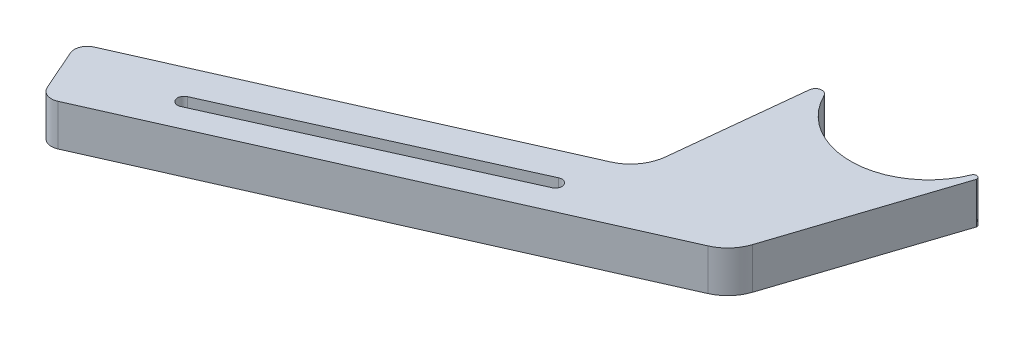
ISO-10303-21;
HEADER;
FILE_DESCRIPTION(('STEP AP214'),'2;1');
FILE_NAME('part.step','',(''),(''),'','','');
FILE_SCHEMA(('AUTOMOTIVE_DESIGN { 1 0 10303 214 1 1 1 1 }'));
ENDSEC;
DATA;
#1=APPLICATION_CONTEXT('core data for automotive mechanical design processes');
#2=APPLICATION_PROTOCOL_DEFINITION('international standard','automotive_design',2000,#1);
#3=PRODUCT_CONTEXT('',#1,'mechanical');
#4=PRODUCT('Part','Part','',(#3));
#5=PRODUCT_RELATED_PRODUCT_CATEGORY('part','',(#4));
#6=PRODUCT_DEFINITION_FORMATION('','',#4);
#7=PRODUCT_DEFINITION_CONTEXT('part definition',#1,'design');
#8=PRODUCT_DEFINITION('design','',#6,#7);
#9=PRODUCT_DEFINITION_SHAPE('','',#8);
#10=(LENGTH_UNIT() NAMED_UNIT(*) SI_UNIT(.MILLI.,.METRE.));
#11=(NAMED_UNIT(*) PLANE_ANGLE_UNIT() SI_UNIT($,.RADIAN.));
#12=(NAMED_UNIT(*) SI_UNIT($,.STERADIAN.) SOLID_ANGLE_UNIT());
#13=UNCERTAINTY_MEASURE_WITH_UNIT(LENGTH_MEASURE(1.E-05),#10,'distance_accuracy_value','');
#14=(GEOMETRIC_REPRESENTATION_CONTEXT(3) GLOBAL_UNCERTAINTY_ASSIGNED_CONTEXT((#13)) GLOBAL_UNIT_ASSIGNED_CONTEXT((#10,
#11,#12)) REPRESENTATION_CONTEXT('',''));
#15=CARTESIAN_POINT('',(0.,0.,0.));
#16=DIRECTION('',(0.,0.,1.));
#17=DIRECTION('',(1.,0.,0.));
#18=AXIS2_PLACEMENT_3D('',#15,#16,#17);
#19=CARTESIAN_POINT('',(-11.6659301366889,6.35,13.7782963331069));
#20=DIRECTION('',(0.,1.,0.));
#21=DIRECTION('',(0.,0.,1.));
#22=AXIS2_PLACEMENT_3D('',#19,#20,#21);
#23=PLANE('',#22);
#24=CARTESIAN_POINT('',(-11.6659301366889,6.35,13.7782963331069));
#25=DIRECTION('',(0.,1.,0.));
#26=DIRECTION('',(0.,0.,1.));
#27=AXIS2_PLACEMENT_3D('',#24,#25,#26);
#28=CIRCLE('',#27,1.);
#29=CARTESIAN_POINT('',(-10.7685508954051,6.35,13.3370362087891));
#30=VERTEX_POINT('',#29);
#31=CARTESIAN_POINT('',(-12.6603165664999,6.35,13.6724869374577));
#32=VERTEX_POINT('',#31);
#33=EDGE_CURVE('E182',#30,#32,#28,.T.);
#34=ORIENTED_EDGE('',*,*,#33,.T.);
#35=DIRECTION('',(-0.105809395649239,0.,0.994386429811038));
#36=VECTOR('',#35,1.);
#37=CARTESIAN_POINT('',(-12.6603165664999,6.35,13.6724869374577));
#38=LINE('',#37,#36);
#39=CARTESIAN_POINT('',(-14.7936717014823,6.35,33.7215514196568));
#40=VERTEX_POINT('',#39);
#41=EDGE_CURVE('E185',#32,#40,#38,.T.);
#42=ORIENTED_EDGE('',*,*,#41,.T.);
#43=CARTESIAN_POINT('',(-20.7599902803485,6.35,33.0866950457614));
#44=DIRECTION('',(0.,-1.,0.));
#45=DIRECTION('',(0.,0.,-1.));
#46=AXIS2_PLACEMENT_3D('',#43,#44,#45);
#47=CIRCLE('',#46,6.);
#48=CARTESIAN_POINT('',(-18.3266327384633,6.35,38.5711066890783));
#49=VERTEX_POINT('',#48);
#50=EDGE_CURVE('E188',#40,#49,#47,.T.);
#51=ORIENTED_EDGE('',*,*,#50,.T.);
#52=DIRECTION('',(-0.914068607219491,0.,0.405559590314197));
#53=VECTOR('',#52,1.);
#54=CARTESIAN_POINT('',(-18.3266327384633,6.35,38.5711066890783));
#55=LINE('',#54,#53);
#56=CARTESIAN_POINT('',(-73.3320689854085,6.35,62.9762574766363));
#57=VERTEX_POINT('',#56);
#58=EDGE_CURVE('E190',#49,#57,#55,.T.);
#59=ORIENTED_EDGE('',*,*,#58,.T.);
#60=CARTESIAN_POINT('',(-72.5209498047802,6.35,64.8043946910753));
#61=DIRECTION('',(0.,1.,0.));
#62=DIRECTION('',(0.,0.,-1.));
#63=AXIS2_PLACEMENT_3D('',#60,#61,#62);
#64=CIRCLE('',#63,2.);
#65=CARTESIAN_POINT('',(-74.3490870192191,6.35,65.6155138717037));
#66=VERTEX_POINT('',#65);
#67=EDGE_CURVE('E192',#57,#66,#64,.T.);
#68=ORIENTED_EDGE('',*,*,#67,.T.);
#69=DIRECTION('',(0.4055595903142,0.,0.91406860721949));
#70=VECTOR('',#69,1.);
#71=CARTESIAN_POINT('',(-74.3490870192191,6.35,65.6155138717037));
#72=LINE('',#71,#70);
#73=CARTESIAN_POINT('',(-71.5344637804712,6.35,71.9592394428257));
#74=VERTEX_POINT('',#73);
#75=EDGE_CURVE('E194',#66,#74,#72,.T.);
#76=ORIENTED_EDGE('',*,*,#75,.T.);
#77=CARTESIAN_POINT('',(-69.7063265660322,6.35,71.1481202621973));
#78=DIRECTION('',(0.,1.,0.));
#79=DIRECTION('',(0.,0.,-1.));
#80=AXIS2_PLACEMENT_3D('',#77,#78,#79);
#81=CIRCLE('',#80,2.);
#82=CARTESIAN_POINT('',(-68.8952073854038,6.35,72.9762574766363));
#83=VERTEX_POINT('',#82);
#84=EDGE_CURVE('E196',#74,#83,#81,.T.);
#85=ORIENTED_EDGE('',*,*,#84,.T.);
#86=DIRECTION('',(0.914068607219488,0.,-0.405559590314204));
#87=VECTOR('',#86,1.);
#88=CARTESIAN_POINT('',(-68.8952073854038,6.35,72.9762574766363));
#89=LINE('',#88,#87);
#90=CARTESIAN_POINT('',(0.303992163412194,6.35,42.2735303537151));
#91=VERTEX_POINT('',#90);
#92=EDGE_CURVE('E198',#83,#91,#89,.T.);
#93=ORIENTED_EDGE('',*,*,#92,.T.);
#94=CARTESIAN_POINT('',(-2.129365378473,6.35,36.7891187103981));
#95=DIRECTION('',(0.,1.,0.));
#96=DIRECTION('',(0.,0.,-1.));
#97=AXIS2_PLACEMENT_3D('',#94,#95,#96);
#98=CIRCLE('',#97,6.);
#99=CARTESIAN_POINT('',(3.57063844024517,6.35,38.6626064916762));
#100=VERTEX_POINT('',#99);
#101=EDGE_CURVE('E200',#91,#100,#98,.T.);
#102=ORIENTED_EDGE('',*,*,#101,.T.);
#103=DIRECTION('',(0.312247963546347,0.,-0.950000636453028));
#104=VECTOR('',#103,1.);
#105=CARTESIAN_POINT('',(12.0827919355146,6.35,12.7647554816999));
#106=LINE('',#105,#104);
#107=CARTESIAN_POINT('',(12.0827919355146,6.35,12.7647554816999));
#108=VERTEX_POINT('',#107);
#109=EDGE_CURVE('E202',#100,#108,#106,.T.);
#110=ORIENTED_EDGE('',*,*,#109,.T.);
#111=CARTESIAN_POINT('',(11.5833889225984,6.35,12.740329456845));
#112=DIRECTION('',(0.,1.,0.));
#113=DIRECTION('',(0.,0.,1.));
#114=AXIS2_PLACEMENT_3D('',#111,#112,#113);
#115=CIRCLE('',#114,0.499999999999999);
#116=CARTESIAN_POINT('',(11.1200533656944,6.35,12.5523928672502));
#117=VERTEX_POINT('',#116);
#118=EDGE_CURVE('E204',#108,#117,#115,.T.);
#119=ORIENTED_EDGE('',*,*,#118,.T.);
#120=CARTESIAN_POINT('',(0.,6.35,8.04191471697526));
#121=DIRECTION('',(0.,-1.,0.));
#122=DIRECTION('',(0.,0.,-1.));
#123=AXIS2_PLACEMENT_3D('',#120,#121,#122);
#124=CIRCLE('',#123,12.);
#125=EDGE_CURVE('E206',#117,#30,#124,.T.);
#126=ORIENTED_EDGE('',*,*,#125,.T.);
#127=EDGE_LOOP('',(#34,#42,#51,#59,#68,#76,#85,#93,#102,#110,#119,#126));
#128=FACE_BOUND('',#127,.T.);
#129=DIRECTION('',(0.911723261272645,0.,-0.410804935284828));
#130=VECTOR('',#129,1.);
#131=CARTESIAN_POINT('',(-58.7364362110002,6.35,64.2285008574035));
#132=LINE('',#131,#130);
#133=CARTESIAN_POINT('',(-58.7364362110002,6.35,64.2285008574035));
#134=VERTEX_POINT('',#133);
#135=CARTESIAN_POINT('',(-19.3991916840417,6.35,46.5038963873766));
#136=VERTEX_POINT('',#135);
#137=EDGE_CURVE('E154',#134,#136,#132,.T.);
#138=ORIENTED_EDGE('',*,*,#137,.F.);
#139=CARTESIAN_POINT('',(-59.147241146285,6.35,63.3167775961309));
#140=DIRECTION('',(0.,1.,0.));
#141=DIRECTION('',(0.,0.,1.));
#142=AXIS2_PLACEMENT_3D('',#139,#140,#141);
#143=CIRCLE('',#142,1.);
#144=CARTESIAN_POINT('',(-59.5580460815699,6.35,62.4050543348582));
#145=VERTEX_POINT('',#144);
#146=EDGE_CURVE('E146',#145,#134,#143,.T.);
#147=ORIENTED_EDGE('',*,*,#146,.F.);
#148=DIRECTION('',(-0.911723261272645,0.,0.410804935284828));
#149=VECTOR('',#148,1.);
#150=CARTESIAN_POINT('',(-59.5580460815699,6.35,62.4050543348582));
#151=LINE('',#150,#149);
#152=CARTESIAN_POINT('',(-20.2208015546113,6.35,44.6804498648313));
#153=VERTEX_POINT('',#152);
#154=EDGE_CURVE('E168',#153,#145,#151,.T.);
#155=ORIENTED_EDGE('',*,*,#154,.F.);
#156=CARTESIAN_POINT('',(-19.8099966193265,6.35,45.592173126104));
#157=DIRECTION('',(0.,1.,0.));
#158=DIRECTION('',(0.,0.,1.));
#159=AXIS2_PLACEMENT_3D('',#156,#157,#158);
#160=CIRCLE('',#159,0.999999999999998);
#161=EDGE_CURVE('E166',#136,#153,#160,.T.);
#162=ORIENTED_EDGE('',*,*,#161,.F.);
#163=EDGE_LOOP('',(#138,#147,#155,#162));
#164=FACE_BOUND('',#163,.T.);
#165=ADVANCED_FACE('F33',(#128,#164),#23,.T.);
#166=CARTESIAN_POINT('',(-11.6659301366889,0.,13.7782963331069));
#167=DIRECTION('',(0.,1.,0.));
#168=DIRECTION('',(0.,0.,1.));
#169=AXIS2_PLACEMENT_3D('',#166,#167,#168);
#170=PLANE('',#169);
#171=CARTESIAN_POINT('',(-11.6659301366889,0.,13.7782963331069));
#172=DIRECTION('',(0.,1.,0.));
#173=DIRECTION('',(0.,0.,1.));
#174=AXIS2_PLACEMENT_3D('',#171,#172,#173);
#175=CIRCLE('',#174,1.);
#176=CARTESIAN_POINT('',(-10.7685508954051,0.,13.3370362087891));
#177=VERTEX_POINT('',#176);
#178=CARTESIAN_POINT('',(-12.6603165664999,0.,13.6724869374577));
#179=VERTEX_POINT('',#178);
#180=EDGE_CURVE('E162',#177,#179,#175,.T.);
#181=ORIENTED_EDGE('',*,*,#180,.F.);
#182=CARTESIAN_POINT('',(0.,0.,8.04191471697526));
#183=DIRECTION('',(0.,-1.,0.));
#184=DIRECTION('',(0.,0.,-1.));
#185=AXIS2_PLACEMENT_3D('',#182,#183,#184);
#186=CIRCLE('',#185,12.);
#187=CARTESIAN_POINT('',(11.1200533656944,0.,12.5523928672502));
#188=VERTEX_POINT('',#187);
#189=EDGE_CURVE('E186',#188,#177,#186,.T.);
#190=ORIENTED_EDGE('',*,*,#189,.F.);
#191=CARTESIAN_POINT('',(11.5833889225984,0.,12.740329456845));
#192=DIRECTION('',(0.,1.,0.));
#193=DIRECTION('',(0.,0.,1.));
#194=AXIS2_PLACEMENT_3D('',#191,#192,#193);
#195=CIRCLE('',#194,0.499999999999999);
#196=CARTESIAN_POINT('',(12.0827919355146,0.,12.7647554816999));
#197=VERTEX_POINT('',#196);
#198=EDGE_CURVE('E229',#197,#188,#195,.T.);
#199=ORIENTED_EDGE('',*,*,#198,.F.);
#200=DIRECTION('',(0.312247963546347,0.,-0.950000636453028));
#201=VECTOR('',#200,1.);
#202=CARTESIAN_POINT('',(12.0827919355146,0.,12.7647554816999));
#203=LINE('',#202,#201);
#204=CARTESIAN_POINT('',(3.57063844024517,0.,38.6626064916762));
#205=VERTEX_POINT('',#204);
#206=EDGE_CURVE('E227',#205,#197,#203,.T.);
#207=ORIENTED_EDGE('',*,*,#206,.F.);
#208=CARTESIAN_POINT('',(-2.129365378473,0.,36.7891187103981));
#209=DIRECTION('',(0.,1.,0.));
#210=DIRECTION('',(0.,0.,-1.));
#211=AXIS2_PLACEMENT_3D('',#208,#209,#210);
#212=CIRCLE('',#211,6.);
#213=CARTESIAN_POINT('',(0.303992163412194,0.,42.2735303537151));
#214=VERTEX_POINT('',#213);
#215=EDGE_CURVE('E225',#214,#205,#212,.T.);
#216=ORIENTED_EDGE('',*,*,#215,.F.);
#217=DIRECTION('',(0.914068607219488,0.,-0.405559590314204));
#218=VECTOR('',#217,1.);
#219=CARTESIAN_POINT('',(-68.8952073854038,0.,72.9762574766363));
#220=LINE('',#219,#218);
#221=CARTESIAN_POINT('',(-68.8952073854038,0.,72.9762574766363));
#222=VERTEX_POINT('',#221);
#223=EDGE_CURVE('E223',#222,#214,#220,.T.);
#224=ORIENTED_EDGE('',*,*,#223,.F.);
#225=CARTESIAN_POINT('',(-69.7063265660322,0.,71.1481202621973));
#226=DIRECTION('',(0.,1.,0.));
#227=DIRECTION('',(0.,0.,-1.));
#228=AXIS2_PLACEMENT_3D('',#225,#226,#227);
#229=CIRCLE('',#228,2.);
#230=CARTESIAN_POINT('',(-71.5344637804712,0.,71.9592394428257));
#231=VERTEX_POINT('',#230);
#232=EDGE_CURVE('E221',#231,#222,#229,.T.);
#233=ORIENTED_EDGE('',*,*,#232,.F.);
#234=DIRECTION('',(0.4055595903142,0.,0.91406860721949));
#235=VECTOR('',#234,1.);
#236=CARTESIAN_POINT('',(-74.3490870192191,0.,65.6155138717037));
#237=LINE('',#236,#235);
#238=CARTESIAN_POINT('',(-74.3490870192191,0.,65.6155138717037));
#239=VERTEX_POINT('',#238);
#240=EDGE_CURVE('E219',#239,#231,#237,.T.);
#241=ORIENTED_EDGE('',*,*,#240,.F.);
#242=CARTESIAN_POINT('',(-72.5209498047802,0.,64.8043946910753));
#243=DIRECTION('',(0.,1.,0.));
#244=DIRECTION('',(0.,0.,-1.));
#245=AXIS2_PLACEMENT_3D('',#242,#243,#244);
#246=CIRCLE('',#245,2.);
#247=CARTESIAN_POINT('',(-73.3320689854085,0.,62.9762574766363));
#248=VERTEX_POINT('',#247);
#249=EDGE_CURVE('E217',#248,#239,#246,.T.);
#250=ORIENTED_EDGE('',*,*,#249,.F.);
#251=DIRECTION('',(-0.914068607219491,0.,0.405559590314197));
#252=VECTOR('',#251,1.);
#253=CARTESIAN_POINT('',(-18.3266327384633,0.,38.5711066890783));
#254=LINE('',#253,#252);
#255=CARTESIAN_POINT('',(-18.3266327384633,0.,38.5711066890783));
#256=VERTEX_POINT('',#255);
#257=EDGE_CURVE('E215',#256,#248,#254,.T.);
#258=ORIENTED_EDGE('',*,*,#257,.F.);
#259=CARTESIAN_POINT('',(-20.7599902803485,0.,33.0866950457614));
#260=DIRECTION('',(0.,-1.,0.));
#261=DIRECTION('',(0.,0.,-1.));
#262=AXIS2_PLACEMENT_3D('',#259,#260,#261);
#263=CIRCLE('',#262,6.);
#264=CARTESIAN_POINT('',(-14.7936717014823,0.,33.7215514196568));
#265=VERTEX_POINT('',#264);
#266=EDGE_CURVE('E213',#265,#256,#263,.T.);
#267=ORIENTED_EDGE('',*,*,#266,.F.);
#268=DIRECTION('',(-0.105809395649239,0.,0.994386429811038));
#269=VECTOR('',#268,1.);
#270=CARTESIAN_POINT('',(-12.6603165664999,0.,13.6724869374577));
#271=LINE('',#270,#269);
#272=EDGE_CURVE('E211',#179,#265,#271,.T.);
#273=ORIENTED_EDGE('',*,*,#272,.F.);
#274=EDGE_LOOP('',(#181,#190,#199,#207,#216,#224,#233,#241,#250,#258,#267,#273));
#275=FACE_BOUND('',#274,.T.);
#276=CARTESIAN_POINT('',(-59.147241146285,0.,63.3167775961309));
#277=DIRECTION('',(0.,1.,0.));
#278=DIRECTION('',(0.,0.,1.));
#279=AXIS2_PLACEMENT_3D('',#276,#277,#278);
#280=CIRCLE('',#279,1.);
#281=CARTESIAN_POINT('',(-59.5580460815699,0.,62.4050543348582));
#282=VERTEX_POINT('',#281);
#283=CARTESIAN_POINT('',(-58.7364362110002,0.,64.2285008574035));
#284=VERTEX_POINT('',#283);
#285=EDGE_CURVE('E56',#282,#284,#280,.T.);
#286=ORIENTED_EDGE('',*,*,#285,.T.);
#287=DIRECTION('',(0.911723261272645,0.,-0.410804935284828));
#288=VECTOR('',#287,1.);
#289=CARTESIAN_POINT('',(-58.7364362110002,0.,64.2285008574035));
#290=LINE('',#289,#288);
#291=CARTESIAN_POINT('',(-19.3991916840417,0.,46.5038963873766));
#292=VERTEX_POINT('',#291);
#293=EDGE_CURVE('E161',#284,#292,#290,.T.);
#294=ORIENTED_EDGE('',*,*,#293,.T.);
#295=CARTESIAN_POINT('',(-19.8099966193265,0.,45.592173126104));
#296=DIRECTION('',(0.,1.,0.));
#297=DIRECTION('',(0.,0.,1.));
#298=AXIS2_PLACEMENT_3D('',#295,#296,#297);
#299=CIRCLE('',#298,0.999999999999998);
#300=CARTESIAN_POINT('',(-20.2208015546113,0.,44.6804498648313));
#301=VERTEX_POINT('',#300);
#302=EDGE_CURVE('E174',#292,#301,#299,.T.);
#303=ORIENTED_EDGE('',*,*,#302,.T.);
#304=DIRECTION('',(-0.911723261272645,0.,0.410804935284828));
#305=VECTOR('',#304,1.);
#306=CARTESIAN_POINT('',(-59.5580460815699,0.,62.4050543348582));
#307=LINE('',#306,#305);
#308=EDGE_CURVE('E155',#301,#282,#307,.T.);
#309=ORIENTED_EDGE('',*,*,#308,.T.);
#310=EDGE_LOOP('',(#286,#294,#303,#309));
#311=FACE_BOUND('',#310,.T.);
#312=ADVANCED_FACE('F271',(#275,#311),#170,.F.);
#313=CARTESIAN_POINT('',(-11.6659301366889,6.35,13.7782963331069));
#314=DIRECTION('',(0.,-1.,0.));
#315=DIRECTION('',(0.,0.,-1.));
#316=AXIS2_PLACEMENT_3D('',#313,#314,#315);
#317=CYLINDRICAL_SURFACE('',#316,1.);
#318=ORIENTED_EDGE('',*,*,#180,.T.);
#319=DIRECTION('',(0.,-1.,0.));
#320=VECTOR('',#319,1.);
#321=CARTESIAN_POINT('',(-12.6603165664999,6.35,13.6724869374577));
#322=LINE('',#321,#320);
#323=EDGE_CURVE('E11',#32,#179,#322,.T.);
#324=ORIENTED_EDGE('',*,*,#323,.F.);
#325=ORIENTED_EDGE('',*,*,#33,.F.);
#326=DIRECTION('',(0.,-1.,0.));
#327=VECTOR('',#326,1.);
#328=CARTESIAN_POINT('',(-10.7685508954051,6.35,13.3370362087891));
#329=LINE('',#328,#327);
#330=EDGE_CURVE('E208',#30,#177,#329,.T.);
#331=ORIENTED_EDGE('',*,*,#330,.T.);
#332=EDGE_LOOP('',(#318,#324,#325,#331));
#333=FACE_BOUND('',#332,.T.);
#334=ADVANCED_FACE('F35',(#333),#317,.T.);
#335=CARTESIAN_POINT('',(-12.6603165664999,6.35,13.6724869374577));
#336=DIRECTION('',(0.994386429811038,0.,0.105809395649239));
#337=DIRECTION('',(0.105809395649239,0.,-0.994386429811038));
#338=AXIS2_PLACEMENT_3D('',#335,#336,#337);
#339=PLANE('',#338);
#340=ORIENTED_EDGE('',*,*,#272,.T.);
#341=DIRECTION('',(0.,-1.,0.));
#342=VECTOR('',#341,1.);
#343=CARTESIAN_POINT('',(-14.7936717014823,6.35,33.7215514196568));
#344=LINE('',#343,#342);
#345=EDGE_CURVE('E41',#40,#265,#344,.T.);
#346=ORIENTED_EDGE('',*,*,#345,.F.);
#347=ORIENTED_EDGE('',*,*,#41,.F.);
#348=ORIENTED_EDGE('',*,*,#323,.T.);
#349=EDGE_LOOP('',(#340,#346,#347,#348));
#350=FACE_BOUND('',#349,.T.);
#351=ADVANCED_FACE('F288',(#350),#339,.F.);
#352=CARTESIAN_POINT('',(-20.7599902803485,6.35,33.0866950457614));
#353=DIRECTION('',(0.,-1.,0.));
#354=DIRECTION('',(0.,0.,-1.));
#355=AXIS2_PLACEMENT_3D('',#352,#353,#354);
#356=CYLINDRICAL_SURFACE('',#355,6.);
#357=ORIENTED_EDGE('',*,*,#266,.T.);
#358=DIRECTION('',(0.,-1.,0.));
#359=VECTOR('',#358,1.);
#360=CARTESIAN_POINT('',(-18.3266327384633,6.35,38.5711066890783));
#361=LINE('',#360,#359);
#362=EDGE_CURVE('E258',#49,#256,#361,.T.);
#363=ORIENTED_EDGE('',*,*,#362,.F.);
#364=ORIENTED_EDGE('',*,*,#50,.F.);
#365=ORIENTED_EDGE('',*,*,#345,.T.);
#366=EDGE_LOOP('',(#357,#363,#364,#365));
#367=FACE_BOUND('',#366,.T.);
#368=ADVANCED_FACE('F265',(#367),#356,.F.);
#369=CARTESIAN_POINT('',(-18.3266327384633,6.35,38.5711066890783));
#370=DIRECTION('',(0.405559590314197,0.,0.914068607219491));
#371=DIRECTION('',(0.914068607219491,0.,-0.405559590314197));
#372=AXIS2_PLACEMENT_3D('',#369,#370,#371);
#373=PLANE('',#372);
#374=ORIENTED_EDGE('',*,*,#257,.T.);
#375=DIRECTION('',(0.,-1.,0.));
#376=VECTOR('',#375,1.);
#377=CARTESIAN_POINT('',(-73.3320689854085,6.35,62.9762574766363));
#378=LINE('',#377,#376);
#379=EDGE_CURVE('E255',#57,#248,#378,.T.);
#380=ORIENTED_EDGE('',*,*,#379,.F.);
#381=ORIENTED_EDGE('',*,*,#58,.F.);
#382=ORIENTED_EDGE('',*,*,#362,.T.);
#383=EDGE_LOOP('',(#374,#380,#381,#382));
#384=FACE_BOUND('',#383,.T.);
#385=ADVANCED_FACE('F277',(#384),#373,.F.);
#386=CARTESIAN_POINT('',(-72.5209498047802,6.35,64.8043946910753));
#387=DIRECTION('',(0.,-1.,0.));
#388=DIRECTION('',(0.,0.,-1.));
#389=AXIS2_PLACEMENT_3D('',#386,#387,#388);
#390=CYLINDRICAL_SURFACE('',#389,2.);
#391=ORIENTED_EDGE('',*,*,#249,.T.);
#392=DIRECTION('',(0.,-1.,0.));
#393=VECTOR('',#392,1.);
#394=CARTESIAN_POINT('',(-74.3490870192191,6.35,65.6155138717037));
#395=LINE('',#394,#393);
#396=EDGE_CURVE('E252',#66,#239,#395,.T.);
#397=ORIENTED_EDGE('',*,*,#396,.F.);
#398=ORIENTED_EDGE('',*,*,#67,.F.);
#399=ORIENTED_EDGE('',*,*,#379,.T.);
#400=EDGE_LOOP('',(#391,#397,#398,#399));
#401=FACE_BOUND('',#400,.T.);
#402=ADVANCED_FACE('F281',(#401),#390,.T.);
#403=CARTESIAN_POINT('',(-74.3490870192191,6.35,65.6155138717037));
#404=DIRECTION('',(0.91406860721949,0.,-0.4055595903142));
#405=DIRECTION('',(-0.4055595903142,0.,-0.91406860721949));
#406=AXIS2_PLACEMENT_3D('',#403,#404,#405);
#407=PLANE('',#406);
#408=ORIENTED_EDGE('',*,*,#240,.T.);
#409=DIRECTION('',(0.,-1.,0.));
#410=VECTOR('',#409,1.);
#411=CARTESIAN_POINT('',(-71.5344637804712,6.35,71.9592394428257));
#412=LINE('',#411,#410);
#413=EDGE_CURVE('E249',#74,#231,#412,.T.);
#414=ORIENTED_EDGE('',*,*,#413,.F.);
#415=ORIENTED_EDGE('',*,*,#75,.F.);
#416=ORIENTED_EDGE('',*,*,#396,.T.);
#417=EDGE_LOOP('',(#408,#414,#415,#416));
#418=FACE_BOUND('',#417,.T.);
#419=ADVANCED_FACE('F321',(#418),#407,.F.);
#420=CARTESIAN_POINT('',(-69.7063265660322,6.35,71.1481202621973));
#421=DIRECTION('',(0.,-1.,0.));
#422=DIRECTION('',(0.,0.,-1.));
#423=AXIS2_PLACEMENT_3D('',#420,#421,#422);
#424=CYLINDRICAL_SURFACE('',#423,2.);
#425=ORIENTED_EDGE('',*,*,#232,.T.);
#426=DIRECTION('',(0.,-1.,0.));
#427=VECTOR('',#426,1.);
#428=CARTESIAN_POINT('',(-68.8952073854038,6.35,72.9762574766363));
#429=LINE('',#428,#427);
#430=EDGE_CURVE('E246',#83,#222,#429,.T.);
#431=ORIENTED_EDGE('',*,*,#430,.F.);
#432=ORIENTED_EDGE('',*,*,#84,.F.);
#433=ORIENTED_EDGE('',*,*,#413,.T.);
#434=EDGE_LOOP('',(#425,#431,#432,#433));
#435=FACE_BOUND('',#434,.T.);
#436=ADVANCED_FACE('F319',(#435),#424,.T.);
#437=CARTESIAN_POINT('',(-68.8952073854038,6.35,72.9762574766363));
#438=DIRECTION('',(-0.405559590314204,0.,-0.914068607219488));
#439=DIRECTION('',(-0.914068607219488,0.,0.405559590314204));
#440=AXIS2_PLACEMENT_3D('',#437,#438,#439);
#441=PLANE('',#440);
#442=ORIENTED_EDGE('',*,*,#223,.T.);
#443=DIRECTION('',(0.,-1.,0.));
#444=VECTOR('',#443,1.);
#445=CARTESIAN_POINT('',(0.303992163412194,6.35,42.2735303537151));
#446=LINE('',#445,#444);
#447=EDGE_CURVE('E243',#91,#214,#446,.T.);
#448=ORIENTED_EDGE('',*,*,#447,.F.);
#449=ORIENTED_EDGE('',*,*,#92,.F.);
#450=ORIENTED_EDGE('',*,*,#430,.T.);
#451=EDGE_LOOP('',(#442,#448,#449,#450));
#452=FACE_BOUND('',#451,.T.);
#453=ADVANCED_FACE('F315',(#452),#441,.F.);
#454=CARTESIAN_POINT('',(-2.129365378473,6.35,36.7891187103981));
#455=DIRECTION('',(0.,-1.,0.));
#456=DIRECTION('',(0.,0.,-1.));
#457=AXIS2_PLACEMENT_3D('',#454,#455,#456);
#458=CYLINDRICAL_SURFACE('',#457,6.);
#459=ORIENTED_EDGE('',*,*,#215,.T.);
#460=DIRECTION('',(0.,-1.,0.));
#461=VECTOR('',#460,1.);
#462=CARTESIAN_POINT('',(3.57063844024517,6.35,38.6626064916762));
#463=LINE('',#462,#461);
#464=EDGE_CURVE('E240',#100,#205,#463,.T.);
#465=ORIENTED_EDGE('',*,*,#464,.F.);
#466=ORIENTED_EDGE('',*,*,#101,.F.);
#467=ORIENTED_EDGE('',*,*,#447,.T.);
#468=EDGE_LOOP('',(#459,#465,#466,#467));
#469=FACE_BOUND('',#468,.T.);
#470=ADVANCED_FACE('F310',(#469),#458,.T.);
#471=CARTESIAN_POINT('',(12.0827919355146,6.35,12.7647554816999));
#472=DIRECTION('',(-0.950000636453028,0.,-0.312247963546347));
#473=DIRECTION('',(-0.312247963546347,0.,0.950000636453028));
#474=AXIS2_PLACEMENT_3D('',#471,#472,#473);
#475=PLANE('',#474);
#476=ORIENTED_EDGE('',*,*,#206,.T.);
#477=DIRECTION('',(0.,-1.,0.));
#478=VECTOR('',#477,1.);
#479=CARTESIAN_POINT('',(12.0827919355146,6.35,12.7647554816999));
#480=LINE('',#479,#478);
#481=EDGE_CURVE('E237',#108,#197,#480,.T.);
#482=ORIENTED_EDGE('',*,*,#481,.F.);
#483=ORIENTED_EDGE('',*,*,#109,.F.);
#484=ORIENTED_EDGE('',*,*,#464,.T.);
#485=EDGE_LOOP('',(#476,#482,#483,#484));
#486=FACE_BOUND('',#485,.T.);
#487=ADVANCED_FACE('F304',(#486),#475,.F.);
#488=CARTESIAN_POINT('',(11.5833889225984,6.35,12.740329456845));
#489=DIRECTION('',(0.,-1.,0.));
#490=DIRECTION('',(0.,0.,-1.));
#491=AXIS2_PLACEMENT_3D('',#488,#489,#490);
#492=CYLINDRICAL_SURFACE('',#491,0.499999999999999);
#493=ORIENTED_EDGE('',*,*,#198,.T.);
#494=DIRECTION('',(0.,-1.,0.));
#495=VECTOR('',#494,1.);
#496=CARTESIAN_POINT('',(11.1200533656944,6.35,12.5523928672502));
#497=LINE('',#496,#495);
#498=EDGE_CURVE('E234',#117,#188,#497,.T.);
#499=ORIENTED_EDGE('',*,*,#498,.F.);
#500=ORIENTED_EDGE('',*,*,#118,.F.);
#501=ORIENTED_EDGE('',*,*,#481,.T.);
#502=EDGE_LOOP('',(#493,#499,#500,#501));
#503=FACE_BOUND('',#502,.T.);
#504=ADVANCED_FACE('F300',(#503),#492,.T.);
#505=CARTESIAN_POINT('',(0.,6.35,8.04191471697526));
#506=DIRECTION('',(0.,-1.,0.));
#507=DIRECTION('',(0.,0.,-1.));
#508=AXIS2_PLACEMENT_3D('',#505,#506,#507);
#509=CYLINDRICAL_SURFACE('',#508,12.);
#510=ORIENTED_EDGE('',*,*,#189,.T.);
#511=ORIENTED_EDGE('',*,*,#330,.F.);
#512=ORIENTED_EDGE('',*,*,#125,.F.);
#513=ORIENTED_EDGE('',*,*,#498,.T.);
#514=EDGE_LOOP('',(#510,#511,#512,#513));
#515=FACE_BOUND('',#514,.T.);
#516=ADVANCED_FACE('F295',(#515),#509,.F.);
#517=CARTESIAN_POINT('',(-59.147241146285,6.35,63.3167775961309));
#518=DIRECTION('',(0.,-1.,0.));
#519=DIRECTION('',(0.,0.,-1.));
#520=AXIS2_PLACEMENT_3D('',#517,#518,#519);
#521=CYLINDRICAL_SURFACE('',#520,1.);
#522=ORIENTED_EDGE('',*,*,#285,.F.);
#523=DIRECTION('',(0.,-1.,0.));
#524=VECTOR('',#523,1.);
#525=CARTESIAN_POINT('',(-59.5580460815699,6.35,62.4050543348582));
#526=LINE('',#525,#524);
#527=EDGE_CURVE('E150',#145,#282,#526,.T.);
#528=ORIENTED_EDGE('',*,*,#527,.F.);
#529=ORIENTED_EDGE('',*,*,#146,.T.);
#530=DIRECTION('',(0.,-1.,0.));
#531=VECTOR('',#530,1.);
#532=CARTESIAN_POINT('',(-58.7364362110002,6.35,64.2285008574035));
#533=LINE('',#532,#531);
#534=EDGE_CURVE('E149',#134,#284,#533,.T.);
#535=ORIENTED_EDGE('',*,*,#534,.T.);
#536=EDGE_LOOP('',(#522,#528,#529,#535));
#537=FACE_BOUND('',#536,.T.);
#538=ADVANCED_FACE('F148',(#537),#521,.F.);
#539=CARTESIAN_POINT('',(-58.7364362110002,6.35,64.2285008574035));
#540=DIRECTION('',(-0.410804935284828,0.,-0.911723261272645));
#541=DIRECTION('',(-0.911723261272646,0.,0.410804935284828));
#542=AXIS2_PLACEMENT_3D('',#539,#540,#541);
#543=PLANE('',#542);
#544=ORIENTED_EDGE('',*,*,#293,.F.);
#545=ORIENTED_EDGE('',*,*,#534,.F.);
#546=ORIENTED_EDGE('',*,*,#137,.T.);
#547=DIRECTION('',(0.,-1.,0.));
#548=VECTOR('',#547,1.);
#549=CARTESIAN_POINT('',(-19.3991916840417,6.35,46.5038963873766));
#550=LINE('',#549,#548);
#551=EDGE_CURVE('E163',#136,#292,#550,.T.);
#552=ORIENTED_EDGE('',*,*,#551,.T.);
#553=EDGE_LOOP('',(#544,#545,#546,#552));
#554=FACE_BOUND('',#553,.T.);
#555=ADVANCED_FACE('F158',(#554),#543,.T.);
#556=CARTESIAN_POINT('',(-19.8099966193265,6.35,45.592173126104));
#557=DIRECTION('',(0.,-1.,0.));
#558=DIRECTION('',(0.,0.,-1.));
#559=AXIS2_PLACEMENT_3D('',#556,#557,#558);
#560=CYLINDRICAL_SURFACE('',#559,0.999999999999998);
#561=ORIENTED_EDGE('',*,*,#302,.F.);
#562=ORIENTED_EDGE('',*,*,#551,.F.);
#563=ORIENTED_EDGE('',*,*,#161,.T.);
#564=DIRECTION('',(0.,-1.,0.));
#565=VECTOR('',#564,1.);
#566=CARTESIAN_POINT('',(-20.2208015546113,6.35,44.6804498648313));
#567=LINE('',#566,#565);
#568=EDGE_CURVE('E48',#153,#301,#567,.T.);
#569=ORIENTED_EDGE('',*,*,#568,.T.);
#570=EDGE_LOOP('',(#561,#562,#563,#569));
#571=FACE_BOUND('',#570,.T.);
#572=ADVANCED_FACE('F379',(#571),#560,.F.);
#573=CARTESIAN_POINT('',(-59.5580460815699,6.35,62.4050543348582));
#574=DIRECTION('',(0.410804935284828,0.,0.911723261272645));
#575=DIRECTION('',(0.911723261272645,0.,-0.410804935284828));
#576=AXIS2_PLACEMENT_3D('',#573,#574,#575);
#577=PLANE('',#576);
#578=ORIENTED_EDGE('',*,*,#308,.F.);
#579=ORIENTED_EDGE('',*,*,#568,.F.);
#580=ORIENTED_EDGE('',*,*,#154,.T.);
#581=ORIENTED_EDGE('',*,*,#527,.T.);
#582=EDGE_LOOP('',(#578,#579,#580,#581));
#583=FACE_BOUND('',#582,.T.);
#584=ADVANCED_FACE('F385',(#583),#577,.T.);
#585=CLOSED_SHELL('',(#165,#312,#334,#351,#368,#385,#402,#419,#436,#453,#470,#487,#504,#516,
#538,#555,#572,#584));
#586=MANIFOLD_SOLID_BREP('B2',#585);
#587=ADVANCED_BREP_SHAPE_REPRESENTATION('',(#18,#586),#14);
#588=SHAPE_DEFINITION_REPRESENTATION(#9,#587);
ENDSEC;
END-ISO-10303-21;
